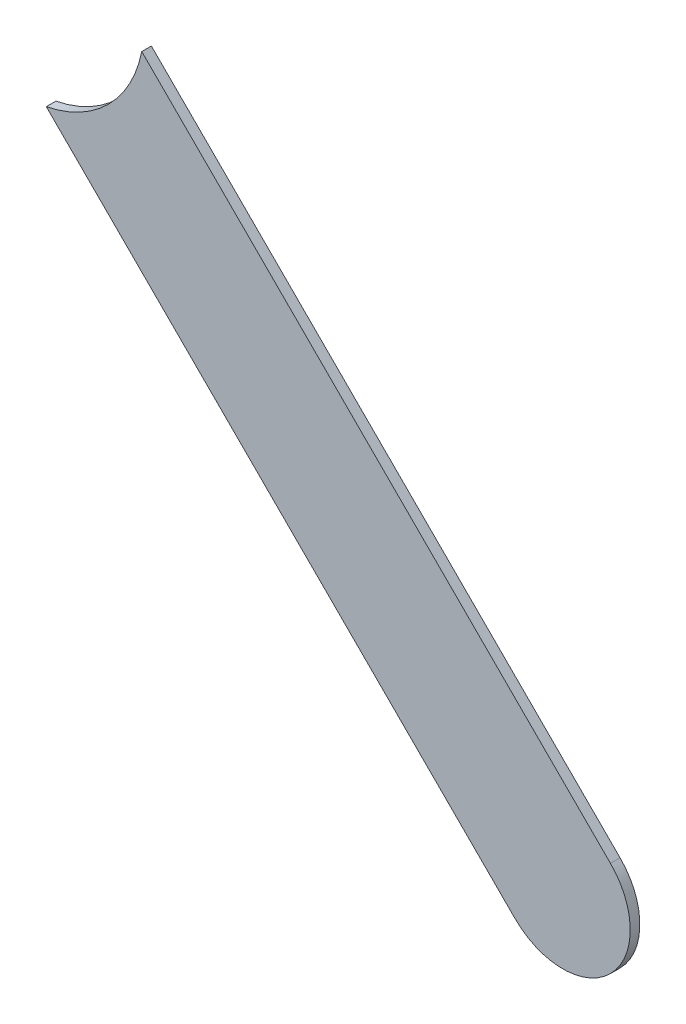
ISO-10303-21;
HEADER;
FILE_DESCRIPTION(('STEP AP214'),'2;1');
FILE_NAME('part.step','',(''),(''),'','','');
FILE_SCHEMA(('AUTOMOTIVE_DESIGN { 1 0 10303 214 1 1 1 1 }'));
ENDSEC;
DATA;
#1=APPLICATION_CONTEXT('core data for automotive mechanical design processes');
#2=APPLICATION_PROTOCOL_DEFINITION('international standard','automotive_design',2000,#1);
#3=PRODUCT_CONTEXT('',#1,'mechanical');
#4=PRODUCT('Part','Part','',(#3));
#5=PRODUCT_RELATED_PRODUCT_CATEGORY('part','',(#4));
#6=PRODUCT_DEFINITION_FORMATION('','',#4);
#7=PRODUCT_DEFINITION_CONTEXT('part definition',#1,'design');
#8=PRODUCT_DEFINITION('design','',#6,#7);
#9=PRODUCT_DEFINITION_SHAPE('','',#8);
#10=(LENGTH_UNIT() NAMED_UNIT(*) SI_UNIT(.MILLI.,.METRE.));
#11=(NAMED_UNIT(*) PLANE_ANGLE_UNIT() SI_UNIT($,.RADIAN.));
#12=(NAMED_UNIT(*) SI_UNIT($,.STERADIAN.) SOLID_ANGLE_UNIT());
#13=UNCERTAINTY_MEASURE_WITH_UNIT(LENGTH_MEASURE(1.E-05),#10,'distance_accuracy_value','');
#14=(GEOMETRIC_REPRESENTATION_CONTEXT(3) GLOBAL_UNCERTAINTY_ASSIGNED_CONTEXT((#13)) GLOBAL_UNIT_ASSIGNED_CONTEXT((#10,
#11,#12)) REPRESENTATION_CONTEXT('',''));
#15=CARTESIAN_POINT('',(0.,0.,0.));
#16=DIRECTION('',(0.,0.,1.));
#17=DIRECTION('',(1.,0.,0.));
#18=AXIS2_PLACEMENT_3D('',#15,#16,#17);
#19=CARTESIAN_POINT('',(33.9878010949451,87.8986505850549,0.));
#20=DIRECTION('',(0.707106781186546,0.707106781186549,0.));
#21=DIRECTION('',(0.707106781186549,-0.707106781186546,0.));
#22=AXIS2_PLACEMENT_3D('',#19,#20,#21);
#23=PLANE('',#22);
#24=DIRECTION('',(0.707106781186549,-0.707106781186546,0.));
#25=VECTOR('',#24,1.);
#26=CARTESIAN_POINT('',(33.7232244,88.16322728,0.03556));
#27=LINE('',#26,#25);
#28=CARTESIAN_POINT('',(33.9878010949451,87.8986505850549,0.03556));
#29=VERTEX_POINT('',#28);
#30=CARTESIAN_POINT('',(35.72322548,86.1632262,0.03556));
#31=VERTEX_POINT('',#30);
#32=EDGE_CURVE('E11',#29,#31,#27,.T.);
#33=ORIENTED_EDGE('',*,*,#32,.F.);
#34=DIRECTION('',(0.,0.,1.));
#35=VECTOR('',#34,1.);
#36=CARTESIAN_POINT('',(33.9878010949451,87.8986505850549,0.));
#37=LINE('',#36,#35);
#38=CARTESIAN_POINT('',(33.9878010949451,87.8986505850549,0.));
#39=VERTEX_POINT('',#38);
#40=EDGE_CURVE('E24',#39,#29,#37,.T.);
#41=ORIENTED_EDGE('',*,*,#40,.F.);
#42=DIRECTION('',(0.707106781186549,-0.707106781186546,0.));
#43=VECTOR('',#42,1.);
#44=CARTESIAN_POINT('',(33.7232244,88.16322728,0.));
#45=LINE('',#44,#43);
#46=CARTESIAN_POINT('',(35.72322548,86.1632262,0.));
#47=VERTEX_POINT('',#46);
#48=EDGE_CURVE('E75',#39,#47,#45,.T.);
#49=ORIENTED_EDGE('',*,*,#48,.T.);
#50=DIRECTION('',(0.,0.,1.));
#51=VECTOR('',#50,1.);
#52=CARTESIAN_POINT('',(35.72322548,86.1632262,0.));
#53=LINE('',#52,#51);
#54=EDGE_CURVE('E37',#47,#31,#53,.T.);
#55=ORIENTED_EDGE('',*,*,#54,.T.);
#56=EDGE_LOOP('',(#33,#41,#49,#55));
#57=FACE_BOUND('',#56,.T.);
#58=ADVANCED_FACE('F17',(#57),#23,.F.);
#59=CARTESIAN_POINT('',(35.90000059,86.34000258,0.));
#60=DIRECTION('',(0.,0.,-1.));
#61=DIRECTION('',(-0.70710424116832,-0.707109321195651,0.));
#62=AXIS2_PLACEMENT_3D('',#59,#60,#61);
#63=CYLINDRICAL_SURFACE('',#62,0.249998656079223);
#64=CARTESIAN_POINT('',(35.90000059,86.34000258,0.03556));
#65=DIRECTION('',(0.,0.,1.));
#66=DIRECTION('',(-0.70710424116832,-0.707109321195651,0.));
#67=AXIS2_PLACEMENT_3D('',#64,#65,#66);
#68=CIRCLE('',#67,0.249998656079223);
#69=CARTESIAN_POINT('',(36.0767757,86.51677896,0.03556));
#70=VERTEX_POINT('',#69);
#71=EDGE_CURVE('E83',#31,#70,#68,.T.);
#72=ORIENTED_EDGE('',*,*,#71,.F.);
#73=ORIENTED_EDGE('',*,*,#54,.F.);
#74=CARTESIAN_POINT('',(35.90000059,86.34000258,0.));
#75=DIRECTION('',(0.,0.,1.));
#76=DIRECTION('',(-0.70710424116832,-0.707109321195651,0.));
#77=AXIS2_PLACEMENT_3D('',#74,#75,#76);
#78=CIRCLE('',#77,0.249998656079223);
#79=CARTESIAN_POINT('',(36.0767757,86.51677896,0.));
#80=VERTEX_POINT('',#79);
#81=EDGE_CURVE('E81',#47,#80,#78,.T.);
#82=ORIENTED_EDGE('',*,*,#81,.T.);
#83=DIRECTION('',(0.,0.,1.));
#84=VECTOR('',#83,1.);
#85=CARTESIAN_POINT('',(36.0767757,86.51677896,0.));
#86=LINE('',#85,#84);
#87=EDGE_CURVE('E67',#80,#70,#86,.T.);
#88=ORIENTED_EDGE('',*,*,#87,.T.);
#89=EDGE_LOOP('',(#72,#73,#82,#88));
#90=FACE_BOUND('',#89,.T.);
#91=ADVANCED_FACE('F89',(#90),#63,.T.);
#92=CARTESIAN_POINT('',(36.0767757,86.51677896,0.));
#93=DIRECTION('',(-0.707106781186546,-0.707106781186549,0.));
#94=DIRECTION('',(-0.707106781186549,0.707106781186546,0.));
#95=AXIS2_PLACEMENT_3D('',#92,#93,#94);
#96=PLANE('',#95);
#97=DIRECTION('',(-0.707106781186549,0.707106781186546,0.));
#98=VECTOR('',#97,1.);
#99=CARTESIAN_POINT('',(36.0767757,86.51677896,0.03556));
#100=LINE('',#99,#98);
#101=CARTESIAN_POINT('',(34.3413517363948,88.2522029236052,0.03556));
#102=VERTEX_POINT('',#101);
#103=EDGE_CURVE('E71',#70,#102,#100,.T.);
#104=ORIENTED_EDGE('',*,*,#103,.F.);
#105=ORIENTED_EDGE('',*,*,#87,.F.);
#106=DIRECTION('',(-0.707106781186549,0.707106781186546,0.));
#107=VECTOR('',#106,1.);
#108=CARTESIAN_POINT('',(36.0767757,86.51677896,0.));
#109=LINE('',#108,#107);
#110=CARTESIAN_POINT('',(34.3413517363948,88.2522029236052,0.));
#111=VERTEX_POINT('',#110);
#112=EDGE_CURVE('E63',#80,#111,#109,.T.);
#113=ORIENTED_EDGE('',*,*,#112,.T.);
#114=DIRECTION('',(0.,0.,1.));
#115=VECTOR('',#114,1.);
#116=CARTESIAN_POINT('',(34.3413517363948,88.2522029236052,0.));
#117=LINE('',#116,#115);
#118=EDGE_CURVE('E53',#111,#102,#117,.T.);
#119=ORIENTED_EDGE('',*,*,#118,.T.);
#120=EDGE_LOOP('',(#104,#105,#113,#119));
#121=FACE_BOUND('',#120,.T.);
#122=ADVANCED_FACE('F66',(#121),#96,.F.);
#123=CARTESIAN_POINT('',(33.90000078,88.34000112,0.));
#124=DIRECTION('',(0.,0.,-1.));
#125=DIRECTION('',(1.,0.,0.));
#126=AXIS2_PLACEMENT_3D('',#123,#124,#125);
#127=CYLINDRICAL_SURFACE('',#126,0.4499991);
#128=ORIENTED_EDGE('',*,*,#40,.T.);
#129=CARTESIAN_POINT('',(33.90000078,88.34000112,0.03556));
#130=DIRECTION('',(0.,0.,1.));
#131=DIRECTION('',(1.,0.,0.));
#132=AXIS2_PLACEMENT_3D('',#129,#130,#131);
#133=CIRCLE('',#132,0.4499991);
#134=EDGE_CURVE('E59',#29,#102,#133,.T.);
#135=ORIENTED_EDGE('',*,*,#134,.T.);
#136=ORIENTED_EDGE('',*,*,#118,.F.);
#137=CARTESIAN_POINT('',(33.90000078,88.34000112,0.));
#138=DIRECTION('',(0.,0.,1.));
#139=DIRECTION('',(1.,0.,0.));
#140=AXIS2_PLACEMENT_3D('',#137,#138,#139);
#141=CIRCLE('',#140,0.4499991);
#142=EDGE_CURVE('E57',#39,#111,#141,.T.);
#143=ORIENTED_EDGE('',*,*,#142,.F.);
#144=EDGE_LOOP('',(#128,#135,#136,#143));
#145=FACE_BOUND('',#144,.T.);
#146=ADVANCED_FACE('F55',(#145),#127,.F.);
#147=CARTESIAN_POINT('',(33.7232244,88.16322728,0.));
#148=DIRECTION('',(0.,0.,-1.));
#149=DIRECTION('',(-1.,0.,0.));
#150=AXIS2_PLACEMENT_3D('',#147,#148,#149);
#151=PLANE('',#150);
#152=ORIENTED_EDGE('',*,*,#48,.F.);
#153=ORIENTED_EDGE('',*,*,#142,.T.);
#154=ORIENTED_EDGE('',*,*,#112,.F.);
#155=ORIENTED_EDGE('',*,*,#81,.F.);
#156=EDGE_LOOP('',(#152,#153,#154,#155));
#157=FACE_BOUND('',#156,.T.);
#158=ADVANCED_FACE('F74',(#157),#151,.T.);
#159=CARTESIAN_POINT('',(33.7232244,88.16322728,0.03556));
#160=DIRECTION('',(0.,0.,-1.));
#161=DIRECTION('',(-1.,0.,0.));
#162=AXIS2_PLACEMENT_3D('',#159,#160,#161);
#163=PLANE('',#162);
#164=ORIENTED_EDGE('',*,*,#134,.F.);
#165=ORIENTED_EDGE('',*,*,#32,.T.);
#166=ORIENTED_EDGE('',*,*,#71,.T.);
#167=ORIENTED_EDGE('',*,*,#103,.T.);
#168=EDGE_LOOP('',(#164,#165,#166,#167));
#169=FACE_BOUND('',#168,.T.);
#170=ADVANCED_FACE('F91',(#169),#163,.F.);
#171=CLOSED_SHELL('',(#58,#91,#122,#146,#158,#170));
#172=MANIFOLD_SOLID_BREP('B1',#171);
#173=ADVANCED_BREP_SHAPE_REPRESENTATION('',(#18,#172),#14);
#174=SHAPE_DEFINITION_REPRESENTATION(#9,#173);
ENDSEC;
END-ISO-10303-21;
